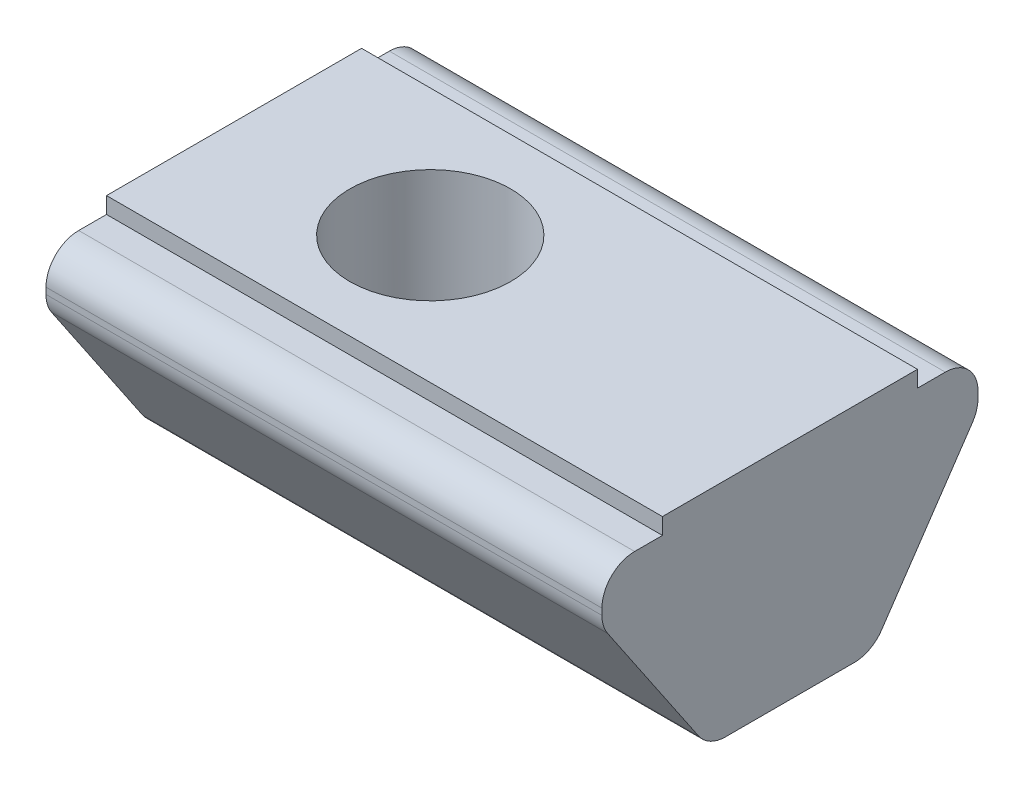
ISO-10303-21;
HEADER;
FILE_DESCRIPTION(('STEP AP214'),'2;1');
FILE_NAME('part.step','',(''),(''),'','','');
FILE_SCHEMA(('AUTOMOTIVE_DESIGN { 1 0 10303 214 1 1 1 1 }'));
ENDSEC;
DATA;
#1=APPLICATION_CONTEXT('core data for automotive mechanical design processes');
#2=APPLICATION_PROTOCOL_DEFINITION('international standard','automotive_design',2000,#1);
#3=PRODUCT_CONTEXT('',#1,'mechanical');
#4=PRODUCT('Part','Part','',(#3));
#5=PRODUCT_RELATED_PRODUCT_CATEGORY('part','',(#4));
#6=PRODUCT_DEFINITION_FORMATION('','',#4);
#7=PRODUCT_DEFINITION_CONTEXT('part definition',#1,'design');
#8=PRODUCT_DEFINITION('design','',#6,#7);
#9=PRODUCT_DEFINITION_SHAPE('','',#8);
#10=(LENGTH_UNIT() NAMED_UNIT(*) SI_UNIT(.MILLI.,.METRE.));
#11=(NAMED_UNIT(*) PLANE_ANGLE_UNIT() SI_UNIT($,.RADIAN.));
#12=(NAMED_UNIT(*) SI_UNIT($,.STERADIAN.) SOLID_ANGLE_UNIT());
#13=UNCERTAINTY_MEASURE_WITH_UNIT(LENGTH_MEASURE(1.E-05),#10,'distance_accuracy_value','');
#14=(GEOMETRIC_REPRESENTATION_CONTEXT(3) GLOBAL_UNCERTAINTY_ASSIGNED_CONTEXT((#13)) GLOBAL_UNIT_ASSIGNED_CONTEXT((#10,
#11,#12)) REPRESENTATION_CONTEXT('',''));
#15=CARTESIAN_POINT('',(0.,0.,0.));
#16=DIRECTION('',(0.,0.,1.));
#17=DIRECTION('',(1.,0.,0.));
#18=AXIS2_PLACEMENT_3D('',#15,#16,#17);
#19=CARTESIAN_POINT('',(11.,-6.8,2.5));
#20=DIRECTION('',(0.,1.,0.));
#21=DIRECTION('',(0.,0.,1.));
#22=AXIS2_PLACEMENT_3D('',#19,#20,#21);
#23=PLANE('',#22);
#24=DIRECTION('',(-1.,0.,0.));
#25=VECTOR('',#24,1.);
#26=CARTESIAN_POINT('',(11.,-6.8,1.96942367917667));
#27=LINE('',#26,#25);
#28=CARTESIAN_POINT('',(6.21786491667289,-6.8,1.96942367917667));
#29=VERTEX_POINT('',#28);
#30=CARTESIAN_POINT('',(1.47159526429593,-6.8,1.96942367917667));
#31=VERTEX_POINT('',#30);
#32=EDGE_CURVE('E196',#29,#31,#27,.T.);
#33=ORIENTED_EDGE('',*,*,#32,.T.);
#34=CARTESIAN_POINT('',(0.,-6.8,0.));
#35=DIRECTION('',(0.,1.,0.));
#36=DIRECTION('',(0.,0.,1.));
#37=AXIS2_PLACEMENT_3D('',#34,#35,#36);
#38=CIRCLE('',#37,2.4585);
#39=CARTESIAN_POINT('',(1.47159526429592,-6.8,-1.96942367917668));
#40=VERTEX_POINT('',#39);
#41=EDGE_CURVE('E53',#31,#40,#38,.T.);
#42=ORIENTED_EDGE('',*,*,#41,.T.);
#43=DIRECTION('',(-1.,0.,0.));
#44=VECTOR('',#43,1.);
#45=CARTESIAN_POINT('',(11.,-6.8,-1.96942367917668));
#46=LINE('',#45,#44);
#47=CARTESIAN_POINT('',(6.2178649166729,-6.8,-1.96942367917668));
#48=VERTEX_POINT('',#47);
#49=EDGE_CURVE('E60',#40,#48,#46,.F.);
#50=ORIENTED_EDGE('',*,*,#49,.T.);
#51=CARTESIAN_POINT('',(7.5,-6.8,0.));
#52=DIRECTION('',(0.,1.,0.));
#53=DIRECTION('',(0.,0.,1.));
#54=AXIS2_PLACEMENT_3D('',#51,#52,#53);
#55=CIRCLE('',#54,2.35);
#56=EDGE_CURVE('E326',#48,#29,#55,.T.);
#57=ORIENTED_EDGE('',*,*,#56,.T.);
#58=EDGE_LOOP('',(#33,#42,#50,#57));
#59=FACE_BOUND('',#58,.T.);
#60=ADVANCED_FACE('F34',(#59),#23,.F.);
#61=CARTESIAN_POINT('',(7.5,-6.6,0.));
#62=DIRECTION('',(0.,-1.,0.));
#63=DIRECTION('',(0.,0.,-1.));
#64=AXIS2_PLACEMENT_3D('',#61,#62,#63);
#65=PLANE('',#64);
#66=CARTESIAN_POINT('',(7.5,-6.6,0.));
#67=DIRECTION('',(0.,1.,0.));
#68=DIRECTION('',(0.,0.,1.));
#69=AXIS2_PLACEMENT_3D('',#66,#67,#68);
#70=CIRCLE('',#69,2.35);
#71=CARTESIAN_POINT('',(7.5,-6.6,2.35));
#72=VERTEX_POINT('',#71);
#73=EDGE_CURVE('E435',#72,#72,#70,.T.);
#74=ORIENTED_EDGE('',*,*,#73,.F.);
#75=EDGE_LOOP('',(#74));
#76=FACE_BOUND('',#75,.T.);
#77=CARTESIAN_POINT('',(7.5,-6.6,0.));
#78=DIRECTION('',(0.,1.,0.));
#79=DIRECTION('',(0.,0.,1.));
#80=AXIS2_PLACEMENT_3D('',#77,#78,#79);
#81=CIRCLE('',#80,1.98997487421324);
#82=CARTESIAN_POINT('',(7.5,-6.6,1.98997487421324));
#83=VERTEX_POINT('',#82);
#84=EDGE_CURVE('E432',#83,#83,#81,.T.);
#85=ORIENTED_EDGE('',*,*,#84,.T.);
#86=EDGE_LOOP('',(#85));
#87=FACE_BOUND('',#86,.T.);
#88=ADVANCED_FACE('F239',(#76,#87),#65,.T.);
#89=CARTESIAN_POINT('',(-6.,-6.8,-1.96942367917668));
#90=VERTEX_POINT('',#89);
#91=CARTESIAN_POINT('',(-1.47159526429592,-6.8,-1.96942367917668));
#92=VERTEX_POINT('',#91);
#93=EDGE_CURVE('E189',#90,#92,#46,.F.);
#94=ORIENTED_EDGE('',*,*,#93,.T.);
#95=CARTESIAN_POINT('',(-1.47159526429593,-6.8,1.96942367917667));
#96=VERTEX_POINT('',#95);
#97=EDGE_CURVE('E176',#92,#96,#38,.T.);
#98=ORIENTED_EDGE('',*,*,#97,.T.);
#99=CARTESIAN_POINT('',(-6.,-6.8,1.96942367917667));
#100=VERTEX_POINT('',#99);
#101=EDGE_CURVE('E186',#96,#100,#27,.T.);
#102=ORIENTED_EDGE('',*,*,#101,.T.);
#103=DIRECTION('',(0.,0.,-1.));
#104=VECTOR('',#103,1.);
#105=CARTESIAN_POINT('',(-6.,-6.8,2.5));
#106=LINE('',#105,#104);
#107=EDGE_CURVE('E395',#100,#90,#106,.T.);
#108=ORIENTED_EDGE('',*,*,#107,.T.);
#109=EDGE_LOOP('',(#94,#98,#102,#108));
#110=FACE_BOUND('',#109,.T.);
#111=ADVANCED_FACE('F184',(#110),#23,.F.);
#112=CARTESIAN_POINT('',(8.78213508332711,-6.8,1.96942367917667));
#113=VERTEX_POINT('',#112);
#114=CARTESIAN_POINT('',(8.78213508332711,-6.8,-1.96942367917668));
#115=VERTEX_POINT('',#114);
#116=EDGE_CURVE('E253',#113,#115,#55,.T.);
#117=ORIENTED_EDGE('',*,*,#116,.T.);
#118=CARTESIAN_POINT('',(11.,-6.8,-1.96942367917668));
#119=VERTEX_POINT('',#118);
#120=EDGE_CURVE('E200',#115,#119,#46,.F.);
#121=ORIENTED_EDGE('',*,*,#120,.T.);
#122=DIRECTION('',(0.,0.,-1.));
#123=VECTOR('',#122,1.);
#124=CARTESIAN_POINT('',(11.,-6.8,2.5));
#125=LINE('',#124,#123);
#126=CARTESIAN_POINT('',(11.,-6.8,1.96942367917667));
#127=VERTEX_POINT('',#126);
#128=EDGE_CURVE('E417',#127,#119,#125,.T.);
#129=ORIENTED_EDGE('',*,*,#128,.F.);
#130=EDGE_CURVE('E198',#127,#113,#27,.T.);
#131=ORIENTED_EDGE('',*,*,#130,.T.);
#132=EDGE_LOOP('',(#117,#121,#129,#131));
#133=FACE_BOUND('',#132,.T.);
#134=ADVANCED_FACE('F260',(#133),#23,.F.);
#135=CARTESIAN_POINT('',(11.,-5.8,1.96942367917667));
#136=DIRECTION('',(-1.,0.,0.));
#137=DIRECTION('',(0.,0.,1.));
#138=AXIS2_PLACEMENT_3D('',#135,#136,#137);
#139=CYLINDRICAL_SURFACE('',#138,1.);
#140=CARTESIAN_POINT('',(1.47159526429593,-6.8,1.96942367917667));
#141=CARTESIAN_POINT('',(1.42306226055965,-6.79998169586473,2.00569675721108));
#142=CARTESIAN_POINT('',(1.37322881206041,-6.79802838677066,2.04012966749318));
#143=CARTESIAN_POINT('',(1.27136263626254,-6.79129349162441,2.10511159264088));
#144=CARTESIAN_POINT('',(1.21933310641445,-6.78651589416931,2.13566601112444));
#145=CARTESIAN_POINT('',(1.11318285320305,-6.77515167599403,2.19287396836667));
#146=CARTESIAN_POINT('',(1.05905646191371,-6.76855980841399,2.21951584401826));
#147=CARTESIAN_POINT('',(0.949069317198564,-6.7545015757545,2.26872655756338));
#148=CARTESIAN_POINT('',(0.893207854766023,-6.74703484963026,2.29129370402796));
#149=CARTESIAN_POINT('',(0.777285230961526,-6.73174924653239,2.33324411775715));
#150=CARTESIAN_POINT('',(0.717150685892136,-6.72393050999268,2.35242492370946));
#151=CARTESIAN_POINT('',(0.595479222224952,-6.70922787760773,2.38612883503056));
#152=CARTESIAN_POINT('',(0.533942417013512,-6.70234390648864,2.40065231556804));
#153=CARTESIAN_POINT('',(0.409935315272322,-6.69034932975242,2.42490297520144));
#154=CARTESIAN_POINT('',(0.3474681518293,-6.6852337627222,2.43464360586464));
#155=CARTESIAN_POINT('',(0.221818336895873,-6.67738164215582,2.44928942949115));
#156=CARTESIAN_POINT('',(0.158635718956328,-6.67464497752647,2.45419484825711));
#157=CARTESIAN_POINT('',(0.0293997586438847,-6.67184852013648,2.45920910553993));
#158=CARTESIAN_POINT('',(-0.0366643523660656,-6.67190397767492,2.45911142873108));
#159=CARTESIAN_POINT('',(-0.168502139209353,-6.67497222177567,2.45360632329089));
#160=CARTESIAN_POINT('',(-0.234275788107658,-6.67798527704726,2.44819841220406));
#161=CARTESIAN_POINT('',(-0.365209323170067,-6.68656352572133,2.4321198802024));
#162=CARTESIAN_POINT('',(-0.430366740653981,-6.6921364372452,2.42143333649582));
#163=CARTESIAN_POINT('',(-0.559441396679849,-6.70508357376401,2.39491059409487));
#164=CARTESIAN_POINT('',(-0.623358080318435,-6.71245858556407,2.37907214505228));
#165=CARTESIAN_POINT('',(-0.807497518142865,-6.73523897302614,2.32551578522718));
#166=CARTESIAN_POINT('',(-0.925715614227161,-6.75181649998783,2.28103992613803));
#167=CARTESIAN_POINT('',(-1.09688437149674,-6.773168465893,2.2011419568373));
#168=CARTESIAN_POINT('',(-1.15283134386299,-6.77969257940486,2.17236729803225));
#169=CARTESIAN_POINT('',(-1.26250969022805,-6.79049652434961,2.11050752005634));
#170=CARTESIAN_POINT('',(-1.31624272300861,-6.79477806526396,2.07742570825754));
#171=CARTESIAN_POINT('',(-1.40357920509111,-6.79904826454022,2.01890117364173));
#172=CARTESIAN_POINT('',(-1.43790836674497,-6.79999341602194,1.99460052004392));
#173=CARTESIAN_POINT('',(-1.47159526429593,-6.8,1.96942367917668));
#174=B_SPLINE_CURVE_WITH_KNOTS('',3,(#140,#141,#142,#143,#144,#145,#146,#147,#148,#149,#150,
#151,#152,#153,#154,#155,#156,#157,#158,#159,#160,#161,#162,#163,#164,#165,#166,#167,#168,#169,
#170,#171,#172,#173),.UNSPECIFIED.,.F.,.F.,(4,2,2,2,2,2,2,2,2,2,2,2,2,2,2,2,4),(0.,
0.181614824562662,0.362973774539501,0.544862826984108,0.726827209256652,0.917445482303758,
1.10804839632494,1.29811213249014,1.4881669923269,1.68607292414298,1.88399683814857,
2.08252146186443,2.28113291768909,2.66151335646595,2.85111024286287,3.04056239111252,
3.16669757490793),.UNSPECIFIED.);
#175=EDGE_CURVE('E11',#31,#96,#174,.T.);
#176=ORIENTED_EDGE('',*,*,#175,.F.);
#177=ORIENTED_EDGE('',*,*,#32,.F.);
#178=CARTESIAN_POINT('',(6.21786491667289,-6.8,1.96942367917667));
#179=CARTESIAN_POINT('',(6.26941318028583,-6.7999783844694,2.00298939808445));
#180=CARTESIAN_POINT('',(6.32224458318778,-6.79831126791625,2.03449549383473));
#181=CARTESIAN_POINT('',(6.43007862404965,-6.79275195363107,2.09320956487121));
#182=CARTESIAN_POINT('',(6.48507930074782,-6.78886172476835,2.12042131620777));
#183=CARTESIAN_POINT('',(6.5970877665072,-6.77990723325075,2.17048964551508));
#184=CARTESIAN_POINT('',(6.65410018896922,-6.77484008688757,2.19333527072562));
#185=CARTESIAN_POINT('',(6.76973175574506,-6.76446242630606,2.2344965080788));
#186=CARTESIAN_POINT('',(6.8283512969707,-6.75915185174641,2.25281098975878));
#187=CARTESIAN_POINT('',(6.94888236347479,-6.74894438318208,2.28534355804725));
#188=CARTESIAN_POINT('',(7.01083836093298,-6.74406733563983,2.2994036657394));
#189=CARTESIAN_POINT('',(7.13577445922008,-6.7356860995647,2.32247152961866));
#190=CARTESIAN_POINT('',(7.19875446874625,-6.73218178932764,2.33147973372814));
#191=CARTESIAN_POINT('',(7.32518942022166,-6.72708124782143,2.34434859910167));
#192=CARTESIAN_POINT('',(7.38864313554109,-6.72548114986431,2.34821969361303));
#193=CARTESIAN_POINT('',(7.51567264327854,-6.72441846070776,2.3508062192578));
#194=CARTESIAN_POINT('',(7.57924843186728,-6.72495580352003,2.34952180955486));
#195=CARTESIAN_POINT('',(7.70530115923049,-6.72806792073519,2.34185667215855));
#196=CARTESIAN_POINT('',(7.76778230964222,-6.73061909717194,2.33553496314835));
#197=CARTESIAN_POINT('',(7.89195507478734,-6.73735308657264,2.31793111965888));
#198=CARTESIAN_POINT('',(7.95364659668612,-6.7415360895992,2.30664840734065));
#199=CARTESIAN_POINT('',(8.07590856167561,-6.75091949811049,2.27920115174183));
#200=CARTESIAN_POINT('',(8.13647799826114,-6.75612077279214,2.26303243130898));
#201=CARTESIAN_POINT('',(8.25611724410548,-6.76673811469897,2.22591828035103));
#202=CARTESIAN_POINT('',(8.31518681755857,-6.77215421535994,2.20497210382764));
#203=CARTESIAN_POINT('',(8.44469791533054,-6.78341725801903,2.15312433078792));
#204=CARTESIAN_POINT('',(8.51469137103973,-6.78908479370067,2.1210426216326));
#205=CARTESIAN_POINT('',(8.61707529883293,-6.79530060779581,2.06787787527475));
#206=CARTESIAN_POINT('',(8.65073584952602,-6.7969910668464,2.04933742726959));
#207=CARTESIAN_POINT('',(8.71714378257571,-6.79933946190278,2.01060666694317));
#208=CARTESIAN_POINT('',(8.74989087413197,-6.79999707270366,1.99041583708332));
#209=CARTESIAN_POINT('',(8.78213508332711,-6.8,1.96942367917667));
#210=B_SPLINE_CURVE_WITH_KNOTS('',3,(#178,#179,#180,#181,#182,#183,#184,#185,#186,#187,#188,
#189,#190,#191,#192,#193,#194,#195,#196,#197,#198,#199,#200,#201,#202,#203,#204,#205,#206,#207,
#208,#209),.UNSPECIFIED.,.F.,.F.,(4,2,2,2,2,2,2,2,2,2,2,2,2,2,2,4),(0.,0.184403443390736,
0.368643824911096,0.553340489318994,0.738083186833674,0.929021574559149,1.11994303023136,
1.31047613621604,1.50100335999993,1.6893305568292,1.87767969511312,2.06619031483349,
2.25473039060528,2.4858939519129,2.6012403850413,2.71662312913064),.UNSPECIFIED.);
#211=EDGE_CURVE('E245',#29,#113,#210,.T.);
#212=ORIENTED_EDGE('',*,*,#211,.T.);
#213=ORIENTED_EDGE('',*,*,#130,.F.);
#214=CARTESIAN_POINT('',(11.,-5.8,1.96942367917667));
#215=DIRECTION('',(1.,0.,0.));
#216=DIRECTION('',(0.,0.,-1.));
#217=AXIS2_PLACEMENT_3D('',#214,#215,#216);
#218=CIRCLE('',#217,1.);
#219=CARTESIAN_POINT('',(11.,-6.36065740956309,2.79747154560832));
#220=VERTEX_POINT('',#219);
#221=EDGE_CURVE('E341',#220,#127,#218,.T.);
#222=ORIENTED_EDGE('',*,*,#221,.F.);
#223=DIRECTION('',(-1.,0.,0.));
#224=VECTOR('',#223,1.);
#225=CARTESIAN_POINT('',(11.,-6.36065740956309,2.79747154560832));
#226=LINE('',#225,#224);
#227=CARTESIAN_POINT('',(-6.,-6.36065740956309,2.79747154560832));
#228=VERTEX_POINT('',#227);
#229=EDGE_CURVE('E333',#228,#220,#226,.F.);
#230=ORIENTED_EDGE('',*,*,#229,.F.);
#231=CARTESIAN_POINT('',(-6.,-5.8,1.96942367917667));
#232=DIRECTION('',(1.,0.,0.));
#233=DIRECTION('',(0.,0.,-1.));
#234=AXIS2_PLACEMENT_3D('',#231,#232,#233);
#235=CIRCLE('',#234,1.);
#236=EDGE_CURVE('E194',#100,#228,#235,.F.);
#237=ORIENTED_EDGE('',*,*,#236,.F.);
#238=ORIENTED_EDGE('',*,*,#101,.F.);
#239=EDGE_LOOP('',(#176,#177,#212,#213,#222,#230,#237,#238));
#240=FACE_BOUND('',#239,.T.);
#241=ADVANCED_FACE('F192',(#240),#139,.T.);
#242=CARTESIAN_POINT('',(11.,-5.8,-1.96942367917668));
#243=DIRECTION('',(-1.,0.,0.));
#244=DIRECTION('',(0.,0.,1.));
#245=AXIS2_PLACEMENT_3D('',#242,#243,#244);
#246=CYLINDRICAL_SURFACE('',#245,1.);
#247=CARTESIAN_POINT('',(-1.47159526429592,-6.8,-1.96942367917668));
#248=CARTESIAN_POINT('',(-1.42306226055964,-6.79998169586472,-2.00569675721108));
#249=CARTESIAN_POINT('',(-1.3732288120604,-6.79802838677066,-2.04012966749319));
#250=CARTESIAN_POINT('',(-1.27136263626254,-6.79129349162441,-2.10511159264088));
#251=CARTESIAN_POINT('',(-1.21933310641445,-6.78651589416931,-2.13566601112445));
#252=CARTESIAN_POINT('',(-1.11318285320304,-6.77515167599403,-2.19287396836667));
#253=CARTESIAN_POINT('',(-1.0590564619137,-6.76855980841399,-2.21951584401827));
#254=CARTESIAN_POINT('',(-0.949069317198557,-6.7545015757545,-2.26872655756339));
#255=CARTESIAN_POINT('',(-0.893207854766016,-6.74703484963026,-2.29129370402797));
#256=CARTESIAN_POINT('',(-0.777285230961518,-6.73174924653238,-2.33324411775716));
#257=CARTESIAN_POINT('',(-0.717150685892128,-6.72393050999268,-2.35242492370946));
#258=CARTESIAN_POINT('',(-0.595479222224944,-6.70922787760772,-2.38612883503056));
#259=CARTESIAN_POINT('',(-0.533942417013504,-6.70234390648864,-2.40065231556804));
#260=CARTESIAN_POINT('',(-0.409935315272313,-6.69034932975241,-2.42490297520145));
#261=CARTESIAN_POINT('',(-0.347468151829292,-6.6852337627222,-2.43464360586464));
#262=CARTESIAN_POINT('',(-0.221818336895864,-6.67738164215582,-2.44928942949115));
#263=CARTESIAN_POINT('',(-0.158635718956319,-6.67464497752647,-2.45419484825711));
#264=CARTESIAN_POINT('',(-0.0293997586438752,-6.67184852013648,-2.45920910553993));
#265=CARTESIAN_POINT('',(0.0366643523660751,-6.67190397767492,-2.45911142873108));
#266=CARTESIAN_POINT('',(0.168502139209362,-6.67497222177567,-2.45360632329089));
#267=CARTESIAN_POINT('',(0.234275788107667,-6.67798527704726,-2.44819841220406));
#268=CARTESIAN_POINT('',(0.365209323170075,-6.68656352572133,-2.4321198802024));
#269=CARTESIAN_POINT('',(0.430366740653989,-6.6921364372452,-2.42143333649582));
#270=CARTESIAN_POINT('',(0.559441396679857,-6.70508357376401,-2.39491059409487));
#271=CARTESIAN_POINT('',(0.623358080318443,-6.71245858556407,-2.37907214505228));
#272=CARTESIAN_POINT('',(0.807497518142873,-6.73523897302614,-2.32551578522717));
#273=CARTESIAN_POINT('',(0.925715614227169,-6.75181649998783,-2.28103992613803));
#274=CARTESIAN_POINT('',(1.09688437149674,-6.773168465893,-2.20114195683729));
#275=CARTESIAN_POINT('',(1.152831343863,-6.77969257940486,-2.17236729803225));
#276=CARTESIAN_POINT('',(1.26250969022806,-6.79049652434961,-2.11050752005633));
#277=CARTESIAN_POINT('',(1.31624272300862,-6.79477806526395,-2.07742570825753));
#278=CARTESIAN_POINT('',(1.40357920509111,-6.79904826454022,-2.01890117364173));
#279=CARTESIAN_POINT('',(1.43790836674497,-6.79999341602194,-1.99460052004392));
#280=CARTESIAN_POINT('',(1.47159526429593,-6.8,-1.96942367917668));
#281=B_SPLINE_CURVE_WITH_KNOTS('',3,(#247,#248,#249,#250,#251,#252,#253,#254,#255,#256,#257,
#258,#259,#260,#261,#262,#263,#264,#265,#266,#267,#268,#269,#270,#271,#272,#273,#274,#275,#276,
#277,#278,#279,#280),.UNSPECIFIED.,.F.,.F.,(4,2,2,2,2,2,2,2,2,2,2,2,2,2,2,2,4),(0.,
0.181614824562663,0.362973774539502,0.544862826984109,0.726827209256654,0.917445482303761,
1.10804839632494,1.29811213249015,1.4881669923269,1.68607292414298,1.88399683814858,
2.08252146186443,2.28113291768909,2.66151335646595,2.85111024286288,3.04056239111252,
3.16669757490792),.UNSPECIFIED.);
#282=EDGE_CURVE('E431',#92,#40,#281,.T.);
#283=ORIENTED_EDGE('',*,*,#282,.F.);
#284=ORIENTED_EDGE('',*,*,#93,.F.);
#285=CARTESIAN_POINT('',(-6.,-5.8,-1.96942367917668));
#286=DIRECTION('',(1.,0.,0.));
#287=DIRECTION('',(0.,0.,-1.));
#288=AXIS2_PLACEMENT_3D('',#285,#286,#287);
#289=CIRCLE('',#288,1.);
#290=CARTESIAN_POINT('',(-6.,-6.36065740956309,-2.79747154560832));
#291=VERTEX_POINT('',#290);
#292=EDGE_CURVE('E355',#291,#90,#289,.F.);
#293=ORIENTED_EDGE('',*,*,#292,.F.);
#294=DIRECTION('',(-1.,0.,0.));
#295=VECTOR('',#294,1.);
#296=CARTESIAN_POINT('',(11.,-6.36065740956309,-2.79747154560832));
#297=LINE('',#296,#295);
#298=CARTESIAN_POINT('',(11.,-6.36065740956309,-2.79747154560832));
#299=VERTEX_POINT('',#298);
#300=EDGE_CURVE('E208',#299,#291,#297,.T.);
#301=ORIENTED_EDGE('',*,*,#300,.F.);
#302=CARTESIAN_POINT('',(11.,-5.8,-1.96942367917668));
#303=DIRECTION('',(1.,0.,0.));
#304=DIRECTION('',(0.,0.,-1.));
#305=AXIS2_PLACEMENT_3D('',#302,#303,#304);
#306=CIRCLE('',#305,1.);
#307=EDGE_CURVE('E330',#119,#299,#306,.T.);
#308=ORIENTED_EDGE('',*,*,#307,.F.);
#309=ORIENTED_EDGE('',*,*,#120,.F.);
#310=CARTESIAN_POINT('',(8.7821350833271,-6.8,-1.96942367917668));
#311=CARTESIAN_POINT('',(8.73058681971416,-6.7999783844694,-2.00298939808445));
#312=CARTESIAN_POINT('',(8.67775541681221,-6.79831126791625,-2.03449549383474));
#313=CARTESIAN_POINT('',(8.56992137595034,-6.79275195363106,-2.09320956487121));
#314=CARTESIAN_POINT('',(8.51492069925218,-6.78886172476835,-2.12042131620777));
#315=CARTESIAN_POINT('',(8.40291223349279,-6.77990723325075,-2.17048964551508));
#316=CARTESIAN_POINT('',(8.34589981103077,-6.77484008688757,-2.19333527072562));
#317=CARTESIAN_POINT('',(8.23026824425493,-6.76446242630606,-2.23449650807881));
#318=CARTESIAN_POINT('',(8.17164870302929,-6.75915185174641,-2.25281098975878));
#319=CARTESIAN_POINT('',(8.0511176365252,-6.74894438318208,-2.28534355804725));
#320=CARTESIAN_POINT('',(7.98916163906701,-6.74406733563983,-2.2994036657394));
#321=CARTESIAN_POINT('',(7.8642255407799,-6.7356860995647,-2.32247152961866));
#322=CARTESIAN_POINT('',(7.80124553125374,-6.73218178932764,-2.33147973372814));
#323=CARTESIAN_POINT('',(7.67481057977833,-6.72708124782143,-2.34434859910167));
#324=CARTESIAN_POINT('',(7.6113568644589,-6.72548114986431,-2.34821969361303));
#325=CARTESIAN_POINT('',(7.48432735672145,-6.72441846070776,-2.35080621925781));
#326=CARTESIAN_POINT('',(7.42075156813271,-6.72495580352003,-2.34952180955486));
#327=CARTESIAN_POINT('',(7.2946988407695,-6.72806792073519,-2.34185667215855));
#328=CARTESIAN_POINT('',(7.23221769035777,-6.73061909717194,-2.33553496314835));
#329=CARTESIAN_POINT('',(7.10804492521265,-6.73735308657264,-2.31793111965888));
#330=CARTESIAN_POINT('',(7.04635340331387,-6.7415360895992,-2.30664840734065));
#331=CARTESIAN_POINT('',(6.92409143832438,-6.75091949811049,-2.27920115174182));
#332=CARTESIAN_POINT('',(6.86352200173885,-6.75612077279214,-2.26303243130898));
#333=CARTESIAN_POINT('',(6.74388275589451,-6.76673811469897,-2.22591828035102));
#334=CARTESIAN_POINT('',(6.68481318244142,-6.77215421535994,-2.20497210382763));
#335=CARTESIAN_POINT('',(6.55530208466945,-6.78341725801903,-2.15312433078791));
#336=CARTESIAN_POINT('',(6.48530862896026,-6.78908479370067,-2.1210426216326));
#337=CARTESIAN_POINT('',(6.38292470116707,-6.79530060779581,-2.06787787527475));
#338=CARTESIAN_POINT('',(6.34926415047398,-6.79699106684639,-2.0493374272696));
#339=CARTESIAN_POINT('',(6.2828562174243,-6.79933946190277,-2.01060666694317));
#340=CARTESIAN_POINT('',(6.25010912586804,-6.79999707270365,-1.99041583708332));
#341=CARTESIAN_POINT('',(6.2178649166729,-6.8,-1.96942367917668));
#342=B_SPLINE_CURVE_WITH_KNOTS('',3,(#310,#311,#312,#313,#314,#315,#316,#317,#318,#319,#320,
#321,#322,#323,#324,#325,#326,#327,#328,#329,#330,#331,#332,#333,#334,#335,#336,#337,#338,#339,
#340,#341),.UNSPECIFIED.,.F.,.F.,(4,2,2,2,2,2,2,2,2,2,2,2,2,2,2,4),(0.,0.184403443390735,
0.368643824911097,0.553340489318994,0.738083186833674,0.929021574559151,1.11994303023136,
1.31047613621604,1.50100335999993,1.6893305568292,1.87767969511312,2.06619031483349,
2.25473039060529,2.48589395191289,2.60124038504129,2.71662312913062),.UNSPECIFIED.);
#343=EDGE_CURVE('E47',#115,#48,#342,.T.);
#344=ORIENTED_EDGE('',*,*,#343,.T.);
#345=ORIENTED_EDGE('',*,*,#49,.F.);
#346=EDGE_LOOP('',(#283,#284,#293,#301,#308,#309,#344,#345));
#347=FACE_BOUND('',#346,.T.);
#348=ADVANCED_FACE('F230',(#347),#246,.T.);
#349=CARTESIAN_POINT('',(11.,-0.500000000000001,5.75));
#350=DIRECTION('',(0.,0.,-1.));
#351=DIRECTION('',(-1.,0.,0.));
#352=AXIS2_PLACEMENT_3D('',#349,#350,#351);
#353=PLANE('',#352);
#354=DIRECTION('',(0.,-1.,0.));
#355=VECTOR('',#354,1.);
#356=CARTESIAN_POINT('',(11.,-0.500000000000001,5.75));
#357=LINE('',#356,#355);
#358=CARTESIAN_POINT('',(11.,-1.5,5.75));
#359=VERTEX_POINT('',#358);
#360=CARTESIAN_POINT('',(11.,-1.69330266463017,5.75));
#361=VERTEX_POINT('',#360);
#362=EDGE_CURVE('E255',#359,#361,#357,.T.);
#363=ORIENTED_EDGE('',*,*,#362,.F.);
#364=DIRECTION('',(-1.,0.,0.));
#365=VECTOR('',#364,1.);
#366=CARTESIAN_POINT('',(11.,-1.5,5.75));
#367=LINE('',#366,#365);
#368=CARTESIAN_POINT('',(-6.,-1.5,5.75));
#369=VERTEX_POINT('',#368);
#370=EDGE_CURVE('E361',#359,#369,#367,.T.);
#371=ORIENTED_EDGE('',*,*,#370,.T.);
#372=DIRECTION('',(0.,-1.,0.));
#373=VECTOR('',#372,1.);
#374=CARTESIAN_POINT('',(-6.,-0.500000000000001,5.75));
#375=LINE('',#374,#373);
#376=CARTESIAN_POINT('',(-6.,-1.69330266463017,5.75));
#377=VERTEX_POINT('',#376);
#378=EDGE_CURVE('E252',#369,#377,#375,.T.);
#379=ORIENTED_EDGE('',*,*,#378,.T.);
#380=DIRECTION('',(-1.,0.,0.));
#381=VECTOR('',#380,1.);
#382=CARTESIAN_POINT('',(11.,-1.69330266463017,5.75));
#383=LINE('',#382,#381);
#384=EDGE_CURVE('E364',#377,#361,#383,.F.);
#385=ORIENTED_EDGE('',*,*,#384,.T.);
#386=EDGE_LOOP('',(#363,#371,#379,#385));
#387=FACE_BOUND('',#386,.T.);
#388=ADVANCED_FACE('F272',(#387),#353,.F.);
#389=CARTESIAN_POINT('',(11.,-2.,5.75));
#390=DIRECTION('',(0.,0.560657409563094,-0.828047866431646));
#391=DIRECTION('',(0.,0.828047866431646,0.560657409563094));
#392=AXIS2_PLACEMENT_3D('',#389,#390,#391);
#393=PLANE('',#392);
#394=DIRECTION('',(0.,-0.828047866431646,-0.560657409563094));
#395=VECTOR('',#394,1.);
#396=CARTESIAN_POINT('',(11.,-2.,5.75));
#397=LINE('',#396,#395);
#398=CARTESIAN_POINT('',(11.,-2.25396007419326,5.57804786643165));
#399=VERTEX_POINT('',#398);
#400=EDGE_CURVE('E418',#399,#220,#397,.T.);
#401=ORIENTED_EDGE('',*,*,#400,.F.);
#402=DIRECTION('',(-1.,0.,0.));
#403=VECTOR('',#402,1.);
#404=CARTESIAN_POINT('',(11.,-2.25396007419326,5.57804786643165));
#405=LINE('',#404,#403);
#406=CARTESIAN_POINT('',(-6.,-2.25396007419326,5.57804786643165));
#407=VERTEX_POINT('',#406);
#408=EDGE_CURVE('E331',#399,#407,#405,.T.);
#409=ORIENTED_EDGE('',*,*,#408,.T.);
#410=DIRECTION('',(0.,-0.828047866431646,-0.560657409563094));
#411=VECTOR('',#410,1.);
#412=CARTESIAN_POINT('',(-6.,-2.,5.75));
#413=LINE('',#412,#411);
#414=EDGE_CURVE('E397',#407,#228,#413,.T.);
#415=ORIENTED_EDGE('',*,*,#414,.T.);
#416=ORIENTED_EDGE('',*,*,#229,.T.);
#417=EDGE_LOOP('',(#401,#409,#415,#416));
#418=FACE_BOUND('',#417,.T.);
#419=ADVANCED_FACE('F275',(#418),#393,.F.);
#420=CARTESIAN_POINT('',(11.,-6.8,-2.5));
#421=DIRECTION('',(0.,0.560657409563094,0.828047866431646));
#422=DIRECTION('',(0.,-0.828047866431646,0.560657409563094));
#423=AXIS2_PLACEMENT_3D('',#420,#421,#422);
#424=PLANE('',#423);
#425=DIRECTION('',(0.,0.828047866431646,-0.560657409563094));
#426=VECTOR('',#425,1.);
#427=CARTESIAN_POINT('',(11.,-6.8,-2.5));
#428=LINE('',#427,#426);
#429=CARTESIAN_POINT('',(11.,-2.25396007419326,-5.57804786643164));
#430=VERTEX_POINT('',#429);
#431=EDGE_CURVE('E415',#299,#430,#428,.T.);
#432=ORIENTED_EDGE('',*,*,#431,.F.);
#433=ORIENTED_EDGE('',*,*,#300,.T.);
#434=DIRECTION('',(0.,0.828047866431646,-0.560657409563094));
#435=VECTOR('',#434,1.);
#436=CARTESIAN_POINT('',(-6.,-6.8,-2.5));
#437=LINE('',#436,#435);
#438=CARTESIAN_POINT('',(-6.,-2.25396007419326,-5.57804786643164));
#439=VERTEX_POINT('',#438);
#440=EDGE_CURVE('E393',#291,#439,#437,.T.);
#441=ORIENTED_EDGE('',*,*,#440,.T.);
#442=DIRECTION('',(-1.,0.,0.));
#443=VECTOR('',#442,1.);
#444=CARTESIAN_POINT('',(11.,-2.25396007419326,-5.57804786643165));
#445=LINE('',#444,#443);
#446=EDGE_CURVE('E203',#439,#430,#445,.F.);
#447=ORIENTED_EDGE('',*,*,#446,.T.);
#448=EDGE_LOOP('',(#432,#433,#441,#447));
#449=FACE_BOUND('',#448,.T.);
#450=ADVANCED_FACE('F279',(#449),#424,.F.);
#451=CARTESIAN_POINT('',(11.,-2.,-5.75));
#452=DIRECTION('',(0.,0.,1.));
#453=DIRECTION('',(1.,0.,0.));
#454=AXIS2_PLACEMENT_3D('',#451,#452,#453);
#455=PLANE('',#454);
#456=DIRECTION('',(0.,1.,0.));
#457=VECTOR('',#456,1.);
#458=CARTESIAN_POINT('',(11.,-2.,-5.75));
#459=LINE('',#458,#457);
#460=CARTESIAN_POINT('',(11.,-1.69330266463017,-5.75));
#461=VERTEX_POINT('',#460);
#462=CARTESIAN_POINT('',(11.,-1.5,-5.75));
#463=VERTEX_POINT('',#462);
#464=EDGE_CURVE('E412',#461,#463,#459,.T.);
#465=ORIENTED_EDGE('',*,*,#464,.F.);
#466=DIRECTION('',(-1.,0.,0.));
#467=VECTOR('',#466,1.);
#468=CARTESIAN_POINT('',(11.,-1.69330266463017,-5.75));
#469=LINE('',#468,#467);
#470=CARTESIAN_POINT('',(-6.,-1.69330266463017,-5.75));
#471=VERTEX_POINT('',#470);
#472=EDGE_CURVE('E219',#461,#471,#469,.T.);
#473=ORIENTED_EDGE('',*,*,#472,.T.);
#474=DIRECTION('',(0.,1.,0.));
#475=VECTOR('',#474,1.);
#476=CARTESIAN_POINT('',(-6.,-2.,-5.75));
#477=LINE('',#476,#475);
#478=CARTESIAN_POINT('',(-6.,-1.5,-5.75));
#479=VERTEX_POINT('',#478);
#480=EDGE_CURVE('E390',#471,#479,#477,.T.);
#481=ORIENTED_EDGE('',*,*,#480,.T.);
#482=DIRECTION('',(-1.,0.,0.));
#483=VECTOR('',#482,1.);
#484=CARTESIAN_POINT('',(11.,-1.5,-5.75));
#485=LINE('',#484,#483);
#486=EDGE_CURVE('E215',#479,#463,#485,.F.);
#487=ORIENTED_EDGE('',*,*,#486,.T.);
#488=EDGE_LOOP('',(#465,#473,#481,#487));
#489=FACE_BOUND('',#488,.T.);
#490=ADVANCED_FACE('F285',(#489),#455,.F.);
#491=CARTESIAN_POINT('',(11.,-0.499999999999999,-5.75));
#492=DIRECTION('',(0.,-1.,0.));
#493=DIRECTION('',(0.,0.,-1.));
#494=AXIS2_PLACEMENT_3D('',#491,#492,#493);
#495=PLANE('',#494);
#496=DIRECTION('',(0.,0.,1.));
#497=VECTOR('',#496,1.);
#498=CARTESIAN_POINT('',(11.,-0.499999999999999,-5.75));
#499=LINE('',#498,#497);
#500=CARTESIAN_POINT('',(11.,-0.499999999999999,-4.75));
#501=VERTEX_POINT('',#500);
#502=CARTESIAN_POINT('',(11.,-0.499999999999999,-3.9));
#503=VERTEX_POINT('',#502);
#504=EDGE_CURVE('E410',#501,#503,#499,.T.);
#505=ORIENTED_EDGE('',*,*,#504,.F.);
#506=DIRECTION('',(-1.,0.,0.));
#507=VECTOR('',#506,1.);
#508=CARTESIAN_POINT('',(11.,-0.499999999999999,-4.75));
#509=LINE('',#508,#507);
#510=CARTESIAN_POINT('',(-6.,-0.499999999999999,-4.75));
#511=VERTEX_POINT('',#510);
#512=EDGE_CURVE('E222',#501,#511,#509,.T.);
#513=ORIENTED_EDGE('',*,*,#512,.T.);
#514=DIRECTION('',(0.,0.,1.));
#515=VECTOR('',#514,1.);
#516=CARTESIAN_POINT('',(-6.,-0.499999999999999,-5.75));
#517=LINE('',#516,#515);
#518=CARTESIAN_POINT('',(-6.,-0.499999999999999,-3.9));
#519=VERTEX_POINT('',#518);
#520=EDGE_CURVE('E388',#511,#519,#517,.T.);
#521=ORIENTED_EDGE('',*,*,#520,.T.);
#522=DIRECTION('',(-1.,0.,0.));
#523=VECTOR('',#522,1.);
#524=CARTESIAN_POINT('',(11.,-0.499999999999999,-3.9));
#525=LINE('',#524,#523);
#526=EDGE_CURVE('E366',#503,#519,#525,.T.);
#527=ORIENTED_EDGE('',*,*,#526,.F.);
#528=EDGE_LOOP('',(#505,#513,#521,#527));
#529=FACE_BOUND('',#528,.T.);
#530=ADVANCED_FACE('F288',(#529),#495,.F.);
#531=CARTESIAN_POINT('',(11.,-0.499999999999999,-3.9));
#532=DIRECTION('',(0.,0.,1.));
#533=DIRECTION('',(1.,0.,0.));
#534=AXIS2_PLACEMENT_3D('',#531,#532,#533);
#535=PLANE('',#534);
#536=DIRECTION('',(0.,1.,0.));
#537=VECTOR('',#536,1.);
#538=CARTESIAN_POINT('',(-6.,-0.499999999999999,-3.9));
#539=LINE('',#538,#537);
#540=CARTESIAN_POINT('',(-6.,0.,-3.9));
#541=VERTEX_POINT('',#540);
#542=EDGE_CURVE('E386',#519,#541,#539,.T.);
#543=ORIENTED_EDGE('',*,*,#542,.T.);
#544=DIRECTION('',(-1.,0.,0.));
#545=VECTOR('',#544,1.);
#546=CARTESIAN_POINT('',(11.,0.,-3.9));
#547=LINE('',#546,#545);
#548=CARTESIAN_POINT('',(11.,0.,-3.9));
#549=VERTEX_POINT('',#548);
#550=EDGE_CURVE('E369',#549,#541,#547,.T.);
#551=ORIENTED_EDGE('',*,*,#550,.F.);
#552=DIRECTION('',(0.,1.,0.));
#553=VECTOR('',#552,1.);
#554=CARTESIAN_POINT('',(11.,-0.499999999999999,-3.9));
#555=LINE('',#554,#553);
#556=EDGE_CURVE('E408',#503,#549,#555,.T.);
#557=ORIENTED_EDGE('',*,*,#556,.F.);
#558=ORIENTED_EDGE('',*,*,#526,.T.);
#559=EDGE_LOOP('',(#543,#551,#557,#558));
#560=FACE_BOUND('',#559,.T.);
#561=ADVANCED_FACE('F292',(#560),#535,.F.);
#562=CARTESIAN_POINT('',(11.,0.,-3.9));
#563=DIRECTION('',(0.,-1.,0.));
#564=DIRECTION('',(0.,0.,-1.));
#565=AXIS2_PLACEMENT_3D('',#562,#563,#564);
#566=PLANE('',#565);
#567=CARTESIAN_POINT('',(0.,0.,0.));
#568=DIRECTION('',(0.,1.,0.));
#569=DIRECTION('',(0.,0.,1.));
#570=AXIS2_PLACEMENT_3D('',#567,#568,#569);
#571=CIRCLE('',#570,2.4585);
#572=CARTESIAN_POINT('',(0.,0.,2.4585));
#573=VERTEX_POINT('',#572);
#574=EDGE_CURVE('E190',#573,#573,#571,.T.);
#575=ORIENTED_EDGE('',*,*,#574,.F.);
#576=EDGE_LOOP('',(#575));
#577=FACE_BOUND('',#576,.T.);
#578=DIRECTION('',(0.,0.,1.));
#579=VECTOR('',#578,1.);
#580=CARTESIAN_POINT('',(-6.,0.,-3.9));
#581=LINE('',#580,#579);
#582=CARTESIAN_POINT('',(-6.,0.,3.9));
#583=VERTEX_POINT('',#582);
#584=EDGE_CURVE('E384',#541,#583,#581,.T.);
#585=ORIENTED_EDGE('',*,*,#584,.T.);
#586=DIRECTION('',(-1.,0.,0.));
#587=VECTOR('',#586,1.);
#588=CARTESIAN_POINT('',(11.,0.,3.9));
#589=LINE('',#588,#587);
#590=CARTESIAN_POINT('',(11.,0.,3.9));
#591=VERTEX_POINT('',#590);
#592=EDGE_CURVE('E372',#591,#583,#589,.T.);
#593=ORIENTED_EDGE('',*,*,#592,.F.);
#594=DIRECTION('',(0.,0.,1.));
#595=VECTOR('',#594,1.);
#596=CARTESIAN_POINT('',(11.,0.,-3.9));
#597=LINE('',#596,#595);
#598=EDGE_CURVE('E406',#549,#591,#597,.T.);
#599=ORIENTED_EDGE('',*,*,#598,.F.);
#600=ORIENTED_EDGE('',*,*,#550,.T.);
#601=EDGE_LOOP('',(#585,#593,#599,#600));
#602=FACE_BOUND('',#601,.T.);
#603=ADVANCED_FACE('F296',(#577,#602),#566,.F.);
#604=CARTESIAN_POINT('',(11.,0.,3.9));
#605=DIRECTION('',(0.,0.,-1.));
#606=DIRECTION('',(0.,1.,0.));
#607=AXIS2_PLACEMENT_3D('',#604,#605,#606);
#608=PLANE('',#607);
#609=DIRECTION('',(0.,-1.,0.));
#610=VECTOR('',#609,1.);
#611=CARTESIAN_POINT('',(-6.,0.,3.9));
#612=LINE('',#611,#610);
#613=CARTESIAN_POINT('',(-6.,-0.5,3.9));
#614=VERTEX_POINT('',#613);
#615=EDGE_CURVE('E382',#583,#614,#612,.T.);
#616=ORIENTED_EDGE('',*,*,#615,.T.);
#617=DIRECTION('',(-1.,0.,0.));
#618=VECTOR('',#617,1.);
#619=CARTESIAN_POINT('',(11.,-0.5,3.9));
#620=LINE('',#619,#618);
#621=CARTESIAN_POINT('',(11.,-0.5,3.9));
#622=VERTEX_POINT('',#621);
#623=EDGE_CURVE('E375',#622,#614,#620,.T.);
#624=ORIENTED_EDGE('',*,*,#623,.F.);
#625=DIRECTION('',(0.,-1.,0.));
#626=VECTOR('',#625,1.);
#627=CARTESIAN_POINT('',(11.,0.,3.9));
#628=LINE('',#627,#626);
#629=EDGE_CURVE('E404',#591,#622,#628,.T.);
#630=ORIENTED_EDGE('',*,*,#629,.F.);
#631=ORIENTED_EDGE('',*,*,#592,.T.);
#632=EDGE_LOOP('',(#616,#624,#630,#631));
#633=FACE_BOUND('',#632,.T.);
#634=ADVANCED_FACE('F300',(#633),#608,.F.);
#635=CARTESIAN_POINT('',(11.,-0.5,3.9));
#636=DIRECTION('',(0.,-1.,0.));
#637=DIRECTION('',(0.,0.,-1.));
#638=AXIS2_PLACEMENT_3D('',#635,#636,#637);
#639=PLANE('',#638);
#640=DIRECTION('',(0.,0.,1.));
#641=VECTOR('',#640,1.);
#642=CARTESIAN_POINT('',(-6.,-0.5,3.9));
#643=LINE('',#642,#641);
#644=CARTESIAN_POINT('',(-6.,-0.500000000000001,4.75));
#645=VERTEX_POINT('',#644);
#646=EDGE_CURVE('E379',#614,#645,#643,.T.);
#647=ORIENTED_EDGE('',*,*,#646,.T.);
#648=DIRECTION('',(-1.,0.,0.));
#649=VECTOR('',#648,1.);
#650=CARTESIAN_POINT('',(11.,-0.500000000000001,4.75));
#651=LINE('',#650,#649);
#652=CARTESIAN_POINT('',(11.,-0.500000000000001,4.75));
#653=VERTEX_POINT('',#652);
#654=EDGE_CURVE('E348',#645,#653,#651,.F.);
#655=ORIENTED_EDGE('',*,*,#654,.T.);
#656=DIRECTION('',(0.,0.,1.));
#657=VECTOR('',#656,1.);
#658=CARTESIAN_POINT('',(11.,-0.5,3.9));
#659=LINE('',#658,#657);
#660=EDGE_CURVE('E378',#622,#653,#659,.T.);
#661=ORIENTED_EDGE('',*,*,#660,.F.);
#662=ORIENTED_EDGE('',*,*,#623,.T.);
#663=EDGE_LOOP('',(#647,#655,#661,#662));
#664=FACE_BOUND('',#663,.T.);
#665=ADVANCED_FACE('F304',(#664),#639,.F.);
#666=CARTESIAN_POINT('',(11.,0.,0.));
#667=DIRECTION('',(1.,0.,0.));
#668=DIRECTION('',(0.,0.,-1.));
#669=AXIS2_PLACEMENT_3D('',#666,#667,#668);
#670=PLANE('',#669);
#671=ORIENTED_EDGE('',*,*,#660,.T.);
#672=CARTESIAN_POINT('',(11.,-1.5,4.75));
#673=DIRECTION('',(1.,0.,0.));
#674=DIRECTION('',(0.,0.,-1.));
#675=AXIS2_PLACEMENT_3D('',#672,#673,#674);
#676=CIRCLE('',#675,1.);
#677=EDGE_CURVE('E337',#653,#359,#676,.T.);
#678=ORIENTED_EDGE('',*,*,#677,.T.);
#679=ORIENTED_EDGE('',*,*,#362,.T.);
#680=CARTESIAN_POINT('',(11.,-1.69330266463017,4.75));
#681=DIRECTION('',(1.,0.,0.));
#682=DIRECTION('',(0.,0.,-1.));
#683=AXIS2_PLACEMENT_3D('',#680,#681,#682);
#684=CIRCLE('',#683,1.);
#685=EDGE_CURVE('E339',#361,#399,#684,.T.);
#686=ORIENTED_EDGE('',*,*,#685,.T.);
#687=ORIENTED_EDGE('',*,*,#400,.T.);
#688=ORIENTED_EDGE('',*,*,#221,.T.);
#689=ORIENTED_EDGE('',*,*,#128,.T.);
#690=ORIENTED_EDGE('',*,*,#307,.T.);
#691=ORIENTED_EDGE('',*,*,#431,.T.);
#692=CARTESIAN_POINT('',(11.,-1.69330266463017,-4.75));
#693=DIRECTION('',(1.,0.,0.));
#694=DIRECTION('',(0.,0.,-1.));
#695=AXIS2_PLACEMENT_3D('',#692,#693,#694);
#696=CIRCLE('',#695,1.);
#697=EDGE_CURVE('E344',#430,#461,#696,.T.);
#698=ORIENTED_EDGE('',*,*,#697,.T.);
#699=ORIENTED_EDGE('',*,*,#464,.T.);
#700=CARTESIAN_POINT('',(11.,-1.5,-4.75));
#701=DIRECTION('',(1.,0.,0.));
#702=DIRECTION('',(0.,0.,-1.));
#703=AXIS2_PLACEMENT_3D('',#700,#701,#702);
#704=CIRCLE('',#703,1.);
#705=EDGE_CURVE('E346',#463,#501,#704,.T.);
#706=ORIENTED_EDGE('',*,*,#705,.T.);
#707=ORIENTED_EDGE('',*,*,#504,.T.);
#708=ORIENTED_EDGE('',*,*,#556,.T.);
#709=ORIENTED_EDGE('',*,*,#598,.T.);
#710=ORIENTED_EDGE('',*,*,#629,.T.);
#711=EDGE_LOOP('',(#671,#678,#679,#686,#687,#688,#689,#690,#691,#698,#699,#706,#707,#708,#709,#710));
#712=FACE_BOUND('',#711,.T.);
#713=ADVANCED_FACE('F241',(#712),#670,.T.);
#714=CARTESIAN_POINT('',(-6.,0.,0.));
#715=DIRECTION('',(1.,0.,0.));
#716=DIRECTION('',(0.,0.,-1.));
#717=AXIS2_PLACEMENT_3D('',#714,#715,#716);
#718=PLANE('',#717);
#719=ORIENTED_EDGE('',*,*,#378,.F.);
#720=CARTESIAN_POINT('',(-6.,-1.5,4.75));
#721=DIRECTION('',(1.,0.,0.));
#722=DIRECTION('',(0.,0.,-1.));
#723=AXIS2_PLACEMENT_3D('',#720,#721,#722);
#724=CIRCLE('',#723,1.);
#725=EDGE_CURVE('E350',#369,#645,#724,.F.);
#726=ORIENTED_EDGE('',*,*,#725,.T.);
#727=ORIENTED_EDGE('',*,*,#646,.F.);
#728=ORIENTED_EDGE('',*,*,#615,.F.);
#729=ORIENTED_EDGE('',*,*,#584,.F.);
#730=ORIENTED_EDGE('',*,*,#542,.F.);
#731=ORIENTED_EDGE('',*,*,#520,.F.);
#732=CARTESIAN_POINT('',(-6.,-1.5,-4.75));
#733=DIRECTION('',(1.,0.,0.));
#734=DIRECTION('',(0.,0.,-1.));
#735=AXIS2_PLACEMENT_3D('',#732,#733,#734);
#736=CIRCLE('',#735,1.);
#737=EDGE_CURVE('E359',#511,#479,#736,.F.);
#738=ORIENTED_EDGE('',*,*,#737,.T.);
#739=ORIENTED_EDGE('',*,*,#480,.F.);
#740=CARTESIAN_POINT('',(-6.,-1.69330266463017,-4.75));
#741=DIRECTION('',(1.,0.,0.));
#742=DIRECTION('',(0.,0.,-1.));
#743=AXIS2_PLACEMENT_3D('',#740,#741,#742);
#744=CIRCLE('',#743,1.);
#745=EDGE_CURVE('E357',#471,#439,#744,.F.);
#746=ORIENTED_EDGE('',*,*,#745,.T.);
#747=ORIENTED_EDGE('',*,*,#440,.F.);
#748=ORIENTED_EDGE('',*,*,#292,.T.);
#749=ORIENTED_EDGE('',*,*,#107,.F.);
#750=ORIENTED_EDGE('',*,*,#236,.T.);
#751=ORIENTED_EDGE('',*,*,#414,.F.);
#752=CARTESIAN_POINT('',(-6.,-1.69330266463017,4.75));
#753=DIRECTION('',(1.,0.,0.));
#754=DIRECTION('',(0.,0.,-1.));
#755=AXIS2_PLACEMENT_3D('',#752,#753,#754);
#756=CIRCLE('',#755,1.);
#757=EDGE_CURVE('E352',#407,#377,#756,.F.);
#758=ORIENTED_EDGE('',*,*,#757,.T.);
#759=EDGE_LOOP('',(#719,#726,#727,#728,#729,#730,#731,#738,#739,#746,#747,#748,#749,#750,#751,#758));
#760=FACE_BOUND('',#759,.T.);
#761=ADVANCED_FACE('F270',(#760),#718,.F.);
#762=CARTESIAN_POINT('',(11.,-1.5,4.75));
#763=DIRECTION('',(-1.,0.,0.));
#764=DIRECTION('',(0.,0.,1.));
#765=AXIS2_PLACEMENT_3D('',#762,#763,#764);
#766=CYLINDRICAL_SURFACE('',#765,1.);
#767=ORIENTED_EDGE('',*,*,#677,.F.);
#768=ORIENTED_EDGE('',*,*,#654,.F.);
#769=ORIENTED_EDGE('',*,*,#725,.F.);
#770=ORIENTED_EDGE('',*,*,#370,.F.);
#771=EDGE_LOOP('',(#767,#768,#769,#770));
#772=FACE_BOUND('',#771,.T.);
#773=ADVANCED_FACE('F266',(#772),#766,.T.);
#774=CARTESIAN_POINT('',(11.,-1.69330266463017,4.75));
#775=DIRECTION('',(-1.,0.,0.));
#776=DIRECTION('',(0.,0.,1.));
#777=AXIS2_PLACEMENT_3D('',#774,#775,#776);
#778=CYLINDRICAL_SURFACE('',#777,1.);
#779=ORIENTED_EDGE('',*,*,#685,.F.);
#780=ORIENTED_EDGE('',*,*,#384,.F.);
#781=ORIENTED_EDGE('',*,*,#757,.F.);
#782=ORIENTED_EDGE('',*,*,#408,.F.);
#783=EDGE_LOOP('',(#779,#780,#781,#782));
#784=FACE_BOUND('',#783,.T.);
#785=ADVANCED_FACE('F261',(#784),#778,.T.);
#786=CARTESIAN_POINT('',(11.,-1.69330266463017,-4.75));
#787=DIRECTION('',(-1.,0.,0.));
#788=DIRECTION('',(0.,0.,1.));
#789=AXIS2_PLACEMENT_3D('',#786,#787,#788);
#790=CYLINDRICAL_SURFACE('',#789,1.);
#791=ORIENTED_EDGE('',*,*,#697,.F.);
#792=ORIENTED_EDGE('',*,*,#446,.F.);
#793=ORIENTED_EDGE('',*,*,#745,.F.);
#794=ORIENTED_EDGE('',*,*,#472,.F.);
#795=EDGE_LOOP('',(#791,#792,#793,#794));
#796=FACE_BOUND('',#795,.T.);
#797=ADVANCED_FACE('F265',(#796),#790,.T.);
#798=CARTESIAN_POINT('',(11.,-1.5,-4.75));
#799=DIRECTION('',(-1.,0.,0.));
#800=DIRECTION('',(0.,0.,1.));
#801=AXIS2_PLACEMENT_3D('',#798,#799,#800);
#802=CYLINDRICAL_SURFACE('',#801,1.);
#803=ORIENTED_EDGE('',*,*,#705,.F.);
#804=ORIENTED_EDGE('',*,*,#486,.F.);
#805=ORIENTED_EDGE('',*,*,#737,.F.);
#806=ORIENTED_EDGE('',*,*,#512,.F.);
#807=EDGE_LOOP('',(#803,#804,#805,#806));
#808=FACE_BOUND('',#807,.T.);
#809=ADVANCED_FACE('F36',(#808),#802,.T.);
#810=CARTESIAN_POINT('',(7.5,1.66554857329047,0.));
#811=DIRECTION('',(0.,1.,0.));
#812=DIRECTION('',(0.,0.,1.));
#813=AXIS2_PLACEMENT_3D('',#810,#811,#812);
#814=CYLINDRICAL_SURFACE('',#813,2.35);
#815=ORIENTED_EDGE('',*,*,#73,.T.);
#816=EDGE_LOOP('',(#815));
#817=FACE_BOUND('',#816,.T.);
#818=ORIENTED_EDGE('',*,*,#56,.F.);
#819=ORIENTED_EDGE('',*,*,#343,.F.);
#820=ORIENTED_EDGE('',*,*,#116,.F.);
#821=ORIENTED_EDGE('',*,*,#211,.F.);
#822=EDGE_LOOP('',(#818,#819,#820,#821));
#823=FACE_BOUND('',#822,.T.);
#824=ADVANCED_FACE('F232',(#817,#823),#814,.F.);
#825=CARTESIAN_POINT('',(7.5,-5.55,0.));
#826=DIRECTION('',(0.,1.,0.));
#827=DIRECTION('',(0.,0.,1.));
#828=AXIS2_PLACEMENT_3D('',#825,#826,#827);
#829=SPHERICAL_SURFACE('',#828,2.25);
#830=ORIENTED_EDGE('',*,*,#84,.F.);
#831=EDGE_LOOP('',(#830));
#832=FACE_BOUND('',#831,.T.);
#833=ADVANCED_FACE('F237',(#832),#829,.T.);
#834=CARTESIAN_POINT('',(0.,0.,0.));
#835=DIRECTION('',(0.,1.,0.));
#836=DIRECTION('',(0.,0.,1.));
#837=AXIS2_PLACEMENT_3D('',#834,#835,#836);
#838=CYLINDRICAL_SURFACE('',#837,2.4585);
#839=ORIENTED_EDGE('',*,*,#282,.T.);
#840=ORIENTED_EDGE('',*,*,#41,.F.);
#841=ORIENTED_EDGE('',*,*,#175,.T.);
#842=ORIENTED_EDGE('',*,*,#97,.F.);
#843=EDGE_LOOP('',(#839,#840,#841,#842));
#844=FACE_BOUND('',#843,.T.);
#845=ORIENTED_EDGE('',*,*,#574,.T.);
#846=EDGE_LOOP('',(#845));
#847=FACE_BOUND('',#846,.T.);
#848=ADVANCED_FACE('F174',(#844,#847),#838,.F.);
#849=CLOSED_SHELL('',(#60,#88,#111,#134,#241,#348,#388,#419,#450,#490,#530,#561,#603,#634,#665,
#713,#761,#773,#785,#797,#809,#824,#833,#848));
#850=MANIFOLD_SOLID_BREP('B2',#849);
#851=ADVANCED_BREP_SHAPE_REPRESENTATION('',(#18,#850),#14);
#852=SHAPE_DEFINITION_REPRESENTATION(#9,#851);
ENDSEC;
END-ISO-10303-21;
